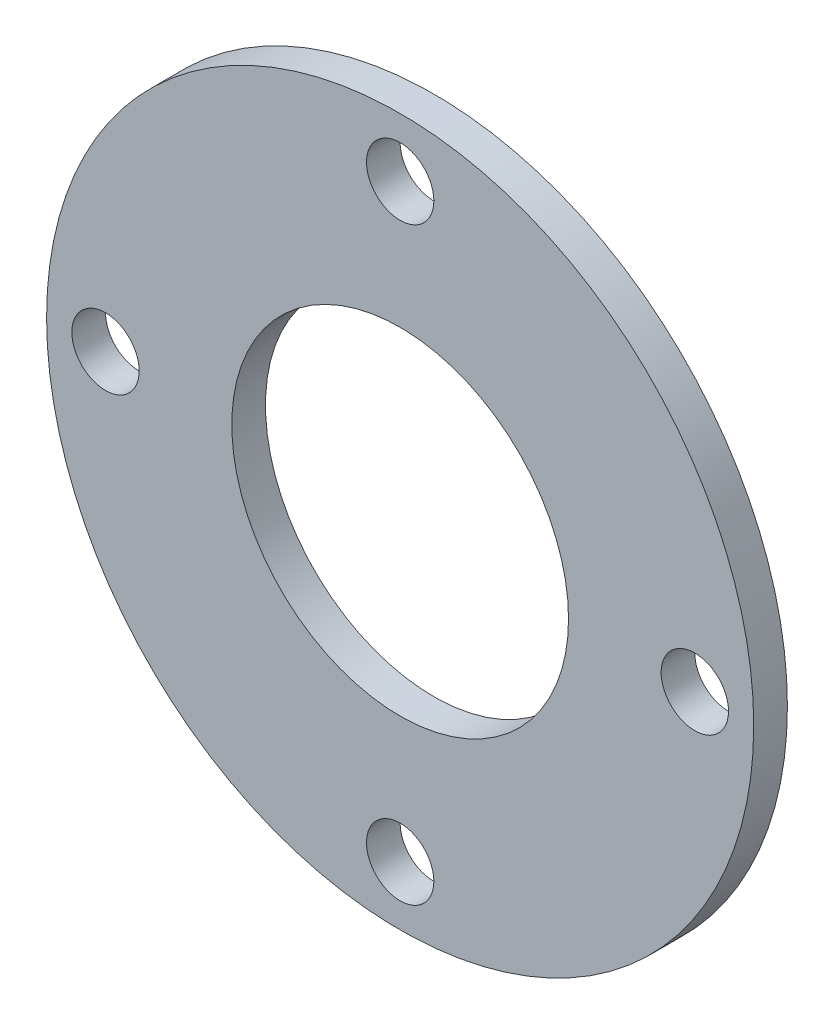
ISO-10303-21;
HEADER;
FILE_DESCRIPTION(('STEP AP214'),'2;1');
FILE_NAME('part.step','',(''),(''),'','','');
FILE_SCHEMA(('AUTOMOTIVE_DESIGN { 1 0 10303 214 1 1 1 1 }'));
ENDSEC;
DATA;
#1=APPLICATION_CONTEXT('core data for automotive mechanical design processes');
#2=APPLICATION_PROTOCOL_DEFINITION('international standard','automotive_design',2000,#1);
#3=PRODUCT_CONTEXT('',#1,'mechanical');
#4=PRODUCT('Part','Part','',(#3));
#5=PRODUCT_RELATED_PRODUCT_CATEGORY('part','',(#4));
#6=PRODUCT_DEFINITION_FORMATION('','',#4);
#7=PRODUCT_DEFINITION_CONTEXT('part definition',#1,'design');
#8=PRODUCT_DEFINITION('design','',#6,#7);
#9=PRODUCT_DEFINITION_SHAPE('','',#8);
#10=(LENGTH_UNIT() NAMED_UNIT(*) SI_UNIT(.MILLI.,.METRE.));
#11=(NAMED_UNIT(*) PLANE_ANGLE_UNIT() SI_UNIT($,.RADIAN.));
#12=(NAMED_UNIT(*) SI_UNIT($,.STERADIAN.) SOLID_ANGLE_UNIT());
#13=UNCERTAINTY_MEASURE_WITH_UNIT(LENGTH_MEASURE(1.E-05),#10,'distance_accuracy_value','');
#14=(GEOMETRIC_REPRESENTATION_CONTEXT(3) GLOBAL_UNCERTAINTY_ASSIGNED_CONTEXT((#13)) GLOBAL_UNIT_ASSIGNED_CONTEXT((#10,
#11,#12)) REPRESENTATION_CONTEXT('',''));
#15=CARTESIAN_POINT('',(0.,0.,0.));
#16=DIRECTION('',(0.,0.,1.));
#17=DIRECTION('',(1.,0.,0.));
#18=AXIS2_PLACEMENT_3D('',#15,#16,#17);
#19=CARTESIAN_POINT('',(0.,0.,2.));
#20=DIRECTION('',(0.,0.,1.));
#21=DIRECTION('',(1.,0.,0.));
#22=AXIS2_PLACEMENT_3D('',#19,#20,#21);
#23=PLANE('',#22);
#24=CARTESIAN_POINT('',(0.,-17.5,2.));
#25=DIRECTION('',(0.,0.,1.));
#26=DIRECTION('',(1.,0.,0.));
#27=AXIS2_PLACEMENT_3D('',#24,#25,#26);
#28=CIRCLE('',#27,2.);
#29=CARTESIAN_POINT('',(2.,-17.5,2.));
#30=VERTEX_POINT('',#29);
#31=EDGE_CURVE('E61',#30,#30,#28,.T.);
#32=ORIENTED_EDGE('',*,*,#31,.F.);
#33=EDGE_LOOP('',(#32));
#34=FACE_BOUND('',#33,.T.);
#35=CARTESIAN_POINT('',(0.,17.5,2.));
#36=DIRECTION('',(0.,0.,1.));
#37=DIRECTION('',(1.,0.,0.));
#38=AXIS2_PLACEMENT_3D('',#35,#36,#37);
#39=CIRCLE('',#38,2.);
#40=CARTESIAN_POINT('',(2.,17.5,2.));
#41=VERTEX_POINT('',#40);
#42=EDGE_CURVE('E49',#41,#41,#39,.T.);
#43=ORIENTED_EDGE('',*,*,#42,.F.);
#44=EDGE_LOOP('',(#43));
#45=FACE_BOUND('',#44,.T.);
#46=CARTESIAN_POINT('',(0.,0.,2.));
#47=DIRECTION('',(0.,0.,1.));
#48=DIRECTION('',(1.,0.,0.));
#49=AXIS2_PLACEMENT_3D('',#46,#47,#48);
#50=CIRCLE('',#49,21.);
#51=CARTESIAN_POINT('',(21.,0.,2.));
#52=VERTEX_POINT('',#51);
#53=EDGE_CURVE('E10',#52,#52,#50,.T.);
#54=ORIENTED_EDGE('',*,*,#53,.T.);
#55=EDGE_LOOP('',(#54));
#56=FACE_BOUND('',#55,.T.);
#57=CARTESIAN_POINT('',(0.,0.,2.));
#58=DIRECTION('',(0.,0.,1.));
#59=DIRECTION('',(1.,0.,0.));
#60=AXIS2_PLACEMENT_3D('',#57,#58,#59);
#61=CIRCLE('',#60,10.);
#62=CARTESIAN_POINT('',(10.,0.,2.));
#63=VERTEX_POINT('',#62);
#64=EDGE_CURVE('E44',#63,#63,#61,.T.);
#65=ORIENTED_EDGE('',*,*,#64,.F.);
#66=EDGE_LOOP('',(#65));
#67=FACE_BOUND('',#66,.T.);
#68=CARTESIAN_POINT('',(-17.5,0.,2.));
#69=DIRECTION('',(0.,0.,1.));
#70=DIRECTION('',(1.,0.,0.));
#71=AXIS2_PLACEMENT_3D('',#68,#69,#70);
#72=CIRCLE('',#71,2.);
#73=CARTESIAN_POINT('',(-15.5,0.,2.));
#74=VERTEX_POINT('',#73);
#75=EDGE_CURVE('E55',#74,#74,#72,.T.);
#76=ORIENTED_EDGE('',*,*,#75,.F.);
#77=EDGE_LOOP('',(#76));
#78=FACE_BOUND('',#77,.T.);
#79=CARTESIAN_POINT('',(17.5,0.,2.));
#80=DIRECTION('',(0.,0.,1.));
#81=DIRECTION('',(1.,0.,0.));
#82=AXIS2_PLACEMENT_3D('',#79,#80,#81);
#83=CIRCLE('',#82,2.);
#84=CARTESIAN_POINT('',(19.5,0.,2.));
#85=VERTEX_POINT('',#84);
#86=EDGE_CURVE('E67',#85,#85,#83,.T.);
#87=ORIENTED_EDGE('',*,*,#86,.F.);
#88=EDGE_LOOP('',(#87));
#89=FACE_BOUND('',#88,.T.);
#90=ADVANCED_FACE('F33',(#34,#45,#56,#67,#78,#89),#23,.T.);
#91=CARTESIAN_POINT('',(0.,0.,0.));
#92=DIRECTION('',(0.,0.,1.));
#93=DIRECTION('',(1.,0.,0.));
#94=AXIS2_PLACEMENT_3D('',#91,#92,#93);
#95=PLANE('',#94);
#96=CARTESIAN_POINT('',(0.,0.,0.));
#97=DIRECTION('',(0.,0.,1.));
#98=DIRECTION('',(1.,0.,0.));
#99=AXIS2_PLACEMENT_3D('',#96,#97,#98);
#100=CIRCLE('',#99,21.);
#101=CARTESIAN_POINT('',(21.,0.,0.));
#102=VERTEX_POINT('',#101);
#103=EDGE_CURVE('E37',#102,#102,#100,.T.);
#104=ORIENTED_EDGE('',*,*,#103,.F.);
#105=EDGE_LOOP('',(#104));
#106=FACE_BOUND('',#105,.T.);
#107=CARTESIAN_POINT('',(0.,0.,0.));
#108=DIRECTION('',(0.,0.,1.));
#109=DIRECTION('',(1.,0.,0.));
#110=AXIS2_PLACEMENT_3D('',#107,#108,#109);
#111=CIRCLE('',#110,10.);
#112=CARTESIAN_POINT('',(10.,0.,0.));
#113=VERTEX_POINT('',#112);
#114=EDGE_CURVE('E46',#113,#113,#111,.T.);
#115=ORIENTED_EDGE('',*,*,#114,.T.);
#116=EDGE_LOOP('',(#115));
#117=FACE_BOUND('',#116,.T.);
#118=CARTESIAN_POINT('',(0.,17.5,0.));
#119=DIRECTION('',(0.,0.,1.));
#120=DIRECTION('',(1.,0.,0.));
#121=AXIS2_PLACEMENT_3D('',#118,#119,#120);
#122=CIRCLE('',#121,2.);
#123=CARTESIAN_POINT('',(2.,17.5,0.));
#124=VERTEX_POINT('',#123);
#125=EDGE_CURVE('E52',#124,#124,#122,.T.);
#126=ORIENTED_EDGE('',*,*,#125,.T.);
#127=EDGE_LOOP('',(#126));
#128=FACE_BOUND('',#127,.T.);
#129=CARTESIAN_POINT('',(-17.5,0.,0.));
#130=DIRECTION('',(0.,0.,1.));
#131=DIRECTION('',(1.,0.,0.));
#132=AXIS2_PLACEMENT_3D('',#129,#130,#131);
#133=CIRCLE('',#132,2.);
#134=CARTESIAN_POINT('',(-15.5,0.,0.));
#135=VERTEX_POINT('',#134);
#136=EDGE_CURVE('E58',#135,#135,#133,.T.);
#137=ORIENTED_EDGE('',*,*,#136,.T.);
#138=EDGE_LOOP('',(#137));
#139=FACE_BOUND('',#138,.T.);
#140=CARTESIAN_POINT('',(0.,-17.5,0.));
#141=DIRECTION('',(0.,0.,1.));
#142=DIRECTION('',(1.,0.,0.));
#143=AXIS2_PLACEMENT_3D('',#140,#141,#142);
#144=CIRCLE('',#143,2.);
#145=CARTESIAN_POINT('',(2.,-17.5,0.));
#146=VERTEX_POINT('',#145);
#147=EDGE_CURVE('E64',#146,#146,#144,.T.);
#148=ORIENTED_EDGE('',*,*,#147,.T.);
#149=EDGE_LOOP('',(#148));
#150=FACE_BOUND('',#149,.T.);
#151=CARTESIAN_POINT('',(17.5,0.,0.));
#152=DIRECTION('',(0.,0.,1.));
#153=DIRECTION('',(1.,0.,0.));
#154=AXIS2_PLACEMENT_3D('',#151,#152,#153);
#155=CIRCLE('',#154,2.);
#156=CARTESIAN_POINT('',(19.5,0.,0.));
#157=VERTEX_POINT('',#156);
#158=EDGE_CURVE('E70',#157,#157,#155,.T.);
#159=ORIENTED_EDGE('',*,*,#158,.T.);
#160=EDGE_LOOP('',(#159));
#161=FACE_BOUND('',#160,.T.);
#162=ADVANCED_FACE('F80',(#106,#117,#128,#139,#150,#161),#95,.F.);
#163=CARTESIAN_POINT('',(0.,0.,2.));
#164=DIRECTION('',(0.,0.,-1.));
#165=DIRECTION('',(-1.,0.,0.));
#166=AXIS2_PLACEMENT_3D('',#163,#164,#165);
#167=CYLINDRICAL_SURFACE('',#166,21.);
#168=ORIENTED_EDGE('',*,*,#53,.F.);
#169=EDGE_LOOP('',(#168));
#170=FACE_BOUND('',#169,.T.);
#171=ORIENTED_EDGE('',*,*,#103,.T.);
#172=EDGE_LOOP('',(#171));
#173=FACE_BOUND('',#172,.T.);
#174=ADVANCED_FACE('F35',(#170,#173),#167,.T.);
#175=CARTESIAN_POINT('',(0.,0.,2.));
#176=DIRECTION('',(0.,0.,-1.));
#177=DIRECTION('',(-1.,0.,0.));
#178=AXIS2_PLACEMENT_3D('',#175,#176,#177);
#179=CYLINDRICAL_SURFACE('',#178,10.);
#180=ORIENTED_EDGE('',*,*,#64,.T.);
#181=EDGE_LOOP('',(#180));
#182=FACE_BOUND('',#181,.T.);
#183=ORIENTED_EDGE('',*,*,#114,.F.);
#184=EDGE_LOOP('',(#183));
#185=FACE_BOUND('',#184,.T.);
#186=ADVANCED_FACE('F90',(#182,#185),#179,.F.);
#187=CARTESIAN_POINT('',(0.,17.5,2.));
#188=DIRECTION('',(0.,0.,-1.));
#189=DIRECTION('',(-1.,0.,0.));
#190=AXIS2_PLACEMENT_3D('',#187,#188,#189);
#191=CYLINDRICAL_SURFACE('',#190,2.);
#192=ORIENTED_EDGE('',*,*,#42,.T.);
#193=EDGE_LOOP('',(#192));
#194=FACE_BOUND('',#193,.T.);
#195=ORIENTED_EDGE('',*,*,#125,.F.);
#196=EDGE_LOOP('',(#195));
#197=FACE_BOUND('',#196,.T.);
#198=ADVANCED_FACE('F93',(#194,#197),#191,.F.);
#199=CARTESIAN_POINT('',(-17.5,0.,2.));
#200=DIRECTION('',(0.,0.,-1.));
#201=DIRECTION('',(-1.,0.,0.));
#202=AXIS2_PLACEMENT_3D('',#199,#200,#201);
#203=CYLINDRICAL_SURFACE('',#202,2.);
#204=ORIENTED_EDGE('',*,*,#75,.T.);
#205=EDGE_LOOP('',(#204));
#206=FACE_BOUND('',#205,.T.);
#207=ORIENTED_EDGE('',*,*,#136,.F.);
#208=EDGE_LOOP('',(#207));
#209=FACE_BOUND('',#208,.T.);
#210=ADVANCED_FACE('F97',(#206,#209),#203,.F.);
#211=CARTESIAN_POINT('',(0.,-17.5,2.));
#212=DIRECTION('',(0.,0.,-1.));
#213=DIRECTION('',(-1.,0.,0.));
#214=AXIS2_PLACEMENT_3D('',#211,#212,#213);
#215=CYLINDRICAL_SURFACE('',#214,2.);
#216=ORIENTED_EDGE('',*,*,#31,.T.);
#217=EDGE_LOOP('',(#216));
#218=FACE_BOUND('',#217,.T.);
#219=ORIENTED_EDGE('',*,*,#147,.F.);
#220=EDGE_LOOP('',(#219));
#221=FACE_BOUND('',#220,.T.);
#222=ADVANCED_FACE('F101',(#218,#221),#215,.F.);
#223=CARTESIAN_POINT('',(17.5,0.,2.));
#224=DIRECTION('',(0.,0.,-1.));
#225=DIRECTION('',(-1.,0.,0.));
#226=AXIS2_PLACEMENT_3D('',#223,#224,#225);
#227=CYLINDRICAL_SURFACE('',#226,2.);
#228=ORIENTED_EDGE('',*,*,#86,.T.);
#229=EDGE_LOOP('',(#228));
#230=FACE_BOUND('',#229,.T.);
#231=ORIENTED_EDGE('',*,*,#158,.F.);
#232=EDGE_LOOP('',(#231));
#233=FACE_BOUND('',#232,.T.);
#234=ADVANCED_FACE('F76',(#230,#233),#227,.F.);
#235=CLOSED_SHELL('',(#90,#162,#174,#186,#198,#210,#222,#234));
#236=MANIFOLD_SOLID_BREP('B2',#235);
#237=ADVANCED_BREP_SHAPE_REPRESENTATION('',(#18,#236),#14);
#238=SHAPE_DEFINITION_REPRESENTATION(#9,#237);
ENDSEC;
END-ISO-10303-21;
